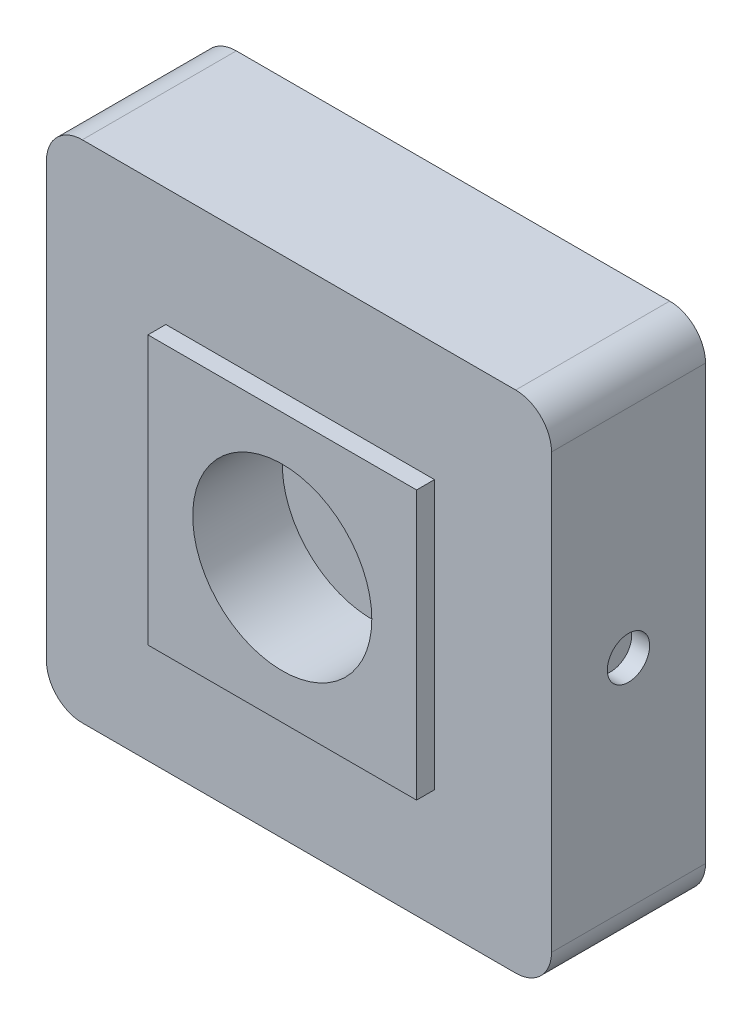
ISO-10303-21;
HEADER;
FILE_DESCRIPTION(('STEP AP214'),'2;1');
FILE_NAME('part.step','',(''),(''),'','','');
FILE_SCHEMA(('AUTOMOTIVE_DESIGN { 1 0 10303 214 1 1 1 1 }'));
ENDSEC;
DATA;
#1=APPLICATION_CONTEXT('core data for automotive mechanical design processes');
#2=APPLICATION_PROTOCOL_DEFINITION('international standard','automotive_design',2000,#1);
#3=PRODUCT_CONTEXT('',#1,'mechanical');
#4=PRODUCT('Part','Part','',(#3));
#5=PRODUCT_RELATED_PRODUCT_CATEGORY('part','',(#4));
#6=PRODUCT_DEFINITION_FORMATION('','',#4);
#7=PRODUCT_DEFINITION_CONTEXT('part definition',#1,'design');
#8=PRODUCT_DEFINITION('design','',#6,#7);
#9=PRODUCT_DEFINITION_SHAPE('','',#8);
#10=(LENGTH_UNIT() NAMED_UNIT(*) SI_UNIT(.MILLI.,.METRE.));
#11=(NAMED_UNIT(*) PLANE_ANGLE_UNIT() SI_UNIT($,.RADIAN.));
#12=(NAMED_UNIT(*) SI_UNIT($,.STERADIAN.) SOLID_ANGLE_UNIT());
#13=UNCERTAINTY_MEASURE_WITH_UNIT(LENGTH_MEASURE(1.E-05),#10,'distance_accuracy_value','');
#14=(GEOMETRIC_REPRESENTATION_CONTEXT(3) GLOBAL_UNCERTAINTY_ASSIGNED_CONTEXT((#13)) GLOBAL_UNIT_ASSIGNED_CONTEXT((#10,
#11,#12)) REPRESENTATION_CONTEXT('',''));
#15=CARTESIAN_POINT('',(0.,0.,0.));
#16=DIRECTION('',(0.,0.,1.));
#17=DIRECTION('',(1.,0.,0.));
#18=AXIS2_PLACEMENT_3D('',#15,#16,#17);
#19=CARTESIAN_POINT('',(2.54,2.54,10.922));
#20=DIRECTION('',(0.,0.,-1.));
#21=DIRECTION('',(-1.,0.,0.));
#22=AXIS2_PLACEMENT_3D('',#19,#20,#21);
#23=PLANE('',#22);
#24=CARTESIAN_POINT('',(2.54,2.54,10.922));
#25=DIRECTION('',(0.,0.,1.));
#26=DIRECTION('',(-1.,0.,0.));
#27=AXIS2_PLACEMENT_3D('',#24,#25,#26);
#28=CIRCLE('',#27,2.54);
#29=CARTESIAN_POINT('',(0.,2.54000000000002,10.922));
#30=VERTEX_POINT('',#29);
#31=CARTESIAN_POINT('',(2.54000000000002,0.,10.922));
#32=VERTEX_POINT('',#31);
#33=EDGE_CURVE('E157',#30,#32,#28,.T.);
#34=ORIENTED_EDGE('',*,*,#33,.T.);
#35=DIRECTION('',(1.,0.,0.));
#36=VECTOR('',#35,1.);
#37=CARTESIAN_POINT('',(2.54000000000002,0.,10.922));
#38=LINE('',#37,#36);
#39=CARTESIAN_POINT('',(33.274,0.,10.922));
#40=VERTEX_POINT('',#39);
#41=EDGE_CURVE('E160',#32,#40,#38,.T.);
#42=ORIENTED_EDGE('',*,*,#41,.T.);
#43=CARTESIAN_POINT('',(33.274,2.54,10.922));
#44=DIRECTION('',(0.,0.,1.));
#45=DIRECTION('',(1.,0.,0.));
#46=AXIS2_PLACEMENT_3D('',#43,#44,#45);
#47=CIRCLE('',#46,2.54);
#48=CARTESIAN_POINT('',(35.814,2.54,10.922));
#49=VERTEX_POINT('',#48);
#50=EDGE_CURVE('E163',#40,#49,#47,.T.);
#51=ORIENTED_EDGE('',*,*,#50,.T.);
#52=DIRECTION('',(0.,1.,0.));
#53=VECTOR('',#52,1.);
#54=CARTESIAN_POINT('',(35.814,2.54000000000002,10.922));
#55=LINE('',#54,#53);
#56=CARTESIAN_POINT('',(35.814,33.274,10.922));
#57=VERTEX_POINT('',#56);
#58=EDGE_CURVE('E165',#49,#57,#55,.T.);
#59=ORIENTED_EDGE('',*,*,#58,.T.);
#60=CARTESIAN_POINT('',(33.274,33.274,10.922));
#61=DIRECTION('',(0.,0.,1.));
#62=DIRECTION('',(-1.,0.,0.));
#63=AXIS2_PLACEMENT_3D('',#60,#61,#62);
#64=CIRCLE('',#63,2.54);
#65=CARTESIAN_POINT('',(33.274,35.814,10.922));
#66=VERTEX_POINT('',#65);
#67=EDGE_CURVE('E167',#57,#66,#64,.T.);
#68=ORIENTED_EDGE('',*,*,#67,.T.);
#69=DIRECTION('',(-1.,0.,0.));
#70=VECTOR('',#69,1.);
#71=CARTESIAN_POINT('',(2.54000000000002,35.814,10.922));
#72=LINE('',#71,#70);
#73=CARTESIAN_POINT('',(2.54000000000002,35.814,10.922));
#74=VERTEX_POINT('',#73);
#75=EDGE_CURVE('E169',#66,#74,#72,.T.);
#76=ORIENTED_EDGE('',*,*,#75,.T.);
#77=CARTESIAN_POINT('',(2.54,33.274,10.922));
#78=DIRECTION('',(0.,0.,1.));
#79=DIRECTION('',(-1.,0.,0.));
#80=AXIS2_PLACEMENT_3D('',#77,#78,#79);
#81=CIRCLE('',#80,2.54);
#82=CARTESIAN_POINT('',(0.,33.274,10.922));
#83=VERTEX_POINT('',#82);
#84=EDGE_CURVE('E171',#74,#83,#81,.T.);
#85=ORIENTED_EDGE('',*,*,#84,.T.);
#86=DIRECTION('',(0.,-1.,0.));
#87=VECTOR('',#86,1.);
#88=CARTESIAN_POINT('',(0.,2.54000000000002,10.922));
#89=LINE('',#88,#87);
#90=EDGE_CURVE('E173',#83,#30,#89,.T.);
#91=ORIENTED_EDGE('',*,*,#90,.T.);
#92=EDGE_LOOP('',(#34,#42,#51,#59,#68,#76,#85,#91));
#93=FACE_BOUND('',#92,.T.);
#94=DIRECTION('',(0.,-1.,0.));
#95=VECTOR('',#94,1.);
#96=CARTESIAN_POINT('',(8.46543456676033,27.432,10.922));
#97=LINE('',#96,#95);
#98=CARTESIAN_POINT('',(8.46543456676033,27.432,10.922));
#99=VERTEX_POINT('',#98);
#100=CARTESIAN_POINT('',(8.46543456676033,8.38199999999999,10.922));
#101=VERTEX_POINT('',#100);
#102=EDGE_CURVE('E54',#99,#101,#97,.T.);
#103=ORIENTED_EDGE('',*,*,#102,.F.);
#104=DIRECTION('',(-1.,0.,0.));
#105=VECTOR('',#104,1.);
#106=CARTESIAN_POINT('',(8.46543456676033,27.432,10.922));
#107=LINE('',#106,#105);
#108=CARTESIAN_POINT('',(27.5154345667603,27.432,10.922));
#109=VERTEX_POINT('',#108);
#110=EDGE_CURVE('E58',#109,#99,#107,.T.);
#111=ORIENTED_EDGE('',*,*,#110,.F.);
#112=DIRECTION('',(0.,1.,0.));
#113=VECTOR('',#112,1.);
#114=CARTESIAN_POINT('',(27.5154345667603,27.432,10.922));
#115=LINE('',#114,#113);
#116=CARTESIAN_POINT('',(27.5154345667603,8.38199999999999,10.922));
#117=VERTEX_POINT('',#116);
#118=EDGE_CURVE('E296',#117,#109,#115,.T.);
#119=ORIENTED_EDGE('',*,*,#118,.F.);
#120=DIRECTION('',(1.,0.,0.));
#121=VECTOR('',#120,1.);
#122=CARTESIAN_POINT('',(8.46543456676033,8.38199999999999,10.922));
#123=LINE('',#122,#121);
#124=EDGE_CURVE('E294',#101,#117,#123,.T.);
#125=ORIENTED_EDGE('',*,*,#124,.F.);
#126=EDGE_LOOP('',(#103,#111,#119,#125));
#127=FACE_BOUND('',#126,.T.);
#128=ADVANCED_FACE('F39',(#93,#127),#23,.F.);
#129=CARTESIAN_POINT('',(2.54,2.54,10.922));
#130=DIRECTION('',(0.,0.,-1.));
#131=DIRECTION('',(-1.,0.,0.));
#132=AXIS2_PLACEMENT_3D('',#129,#130,#131);
#133=CYLINDRICAL_SURFACE('',#132,2.54);
#134=CARTESIAN_POINT('',(2.54,2.54,0.));
#135=DIRECTION('',(0.,0.,1.));
#136=DIRECTION('',(-1.,0.,0.));
#137=AXIS2_PLACEMENT_3D('',#134,#135,#136);
#138=CIRCLE('',#137,2.54);
#139=CARTESIAN_POINT('',(0.,2.54000000000002,0.));
#140=VERTEX_POINT('',#139);
#141=CARTESIAN_POINT('',(2.54000000000002,0.,0.));
#142=VERTEX_POINT('',#141);
#143=EDGE_CURVE('E148',#140,#142,#138,.T.);
#144=ORIENTED_EDGE('',*,*,#143,.T.);
#145=DIRECTION('',(0.,0.,-1.));
#146=VECTOR('',#145,1.);
#147=CARTESIAN_POINT('',(2.54000000000002,0.,10.922));
#148=LINE('',#147,#146);
#149=EDGE_CURVE('E11',#32,#142,#148,.T.);
#150=ORIENTED_EDGE('',*,*,#149,.F.);
#151=ORIENTED_EDGE('',*,*,#33,.F.);
#152=DIRECTION('',(0.,0.,-1.));
#153=VECTOR('',#152,1.);
#154=CARTESIAN_POINT('',(0.,2.54000000000002,10.922));
#155=LINE('',#154,#153);
#156=EDGE_CURVE('E174',#30,#140,#155,.T.);
#157=ORIENTED_EDGE('',*,*,#156,.T.);
#158=EDGE_LOOP('',(#144,#150,#151,#157));
#159=FACE_BOUND('',#158,.T.);
#160=ADVANCED_FACE('F41',(#159),#133,.T.);
#161=CARTESIAN_POINT('',(2.54000000000002,0.,10.922));
#162=DIRECTION('',(0.,1.,0.));
#163=DIRECTION('',(0.,0.,1.));
#164=AXIS2_PLACEMENT_3D('',#161,#162,#163);
#165=PLANE('',#164);
#166=DIRECTION('',(1.,0.,0.));
#167=VECTOR('',#166,1.);
#168=CARTESIAN_POINT('',(2.54000000000002,0.,0.));
#169=LINE('',#168,#167);
#170=CARTESIAN_POINT('',(33.274,0.,0.));
#171=VERTEX_POINT('',#170);
#172=EDGE_CURVE('E151',#142,#171,#169,.T.);
#173=ORIENTED_EDGE('',*,*,#172,.T.);
#174=DIRECTION('',(0.,0.,-1.));
#175=VECTOR('',#174,1.);
#176=CARTESIAN_POINT('',(33.274,0.,10.922));
#177=LINE('',#176,#175);
#178=EDGE_CURVE('E47',#40,#171,#177,.T.);
#179=ORIENTED_EDGE('',*,*,#178,.F.);
#180=ORIENTED_EDGE('',*,*,#41,.F.);
#181=ORIENTED_EDGE('',*,*,#149,.T.);
#182=EDGE_LOOP('',(#173,#179,#180,#181));
#183=FACE_BOUND('',#182,.T.);
#184=ADVANCED_FACE('F231',(#183),#165,.F.);
#185=CARTESIAN_POINT('',(33.274,2.54,10.922));
#186=DIRECTION('',(0.,0.,-1.));
#187=DIRECTION('',(-1.,0.,0.));
#188=AXIS2_PLACEMENT_3D('',#185,#186,#187);
#189=CYLINDRICAL_SURFACE('',#188,2.54);
#190=CARTESIAN_POINT('',(33.274,2.54,0.));
#191=DIRECTION('',(0.,0.,1.));
#192=DIRECTION('',(1.,0.,0.));
#193=AXIS2_PLACEMENT_3D('',#190,#191,#192);
#194=CIRCLE('',#193,2.54);
#195=CARTESIAN_POINT('',(35.814,2.54,0.));
#196=VERTEX_POINT('',#195);
#197=EDGE_CURVE('E177',#171,#196,#194,.T.);
#198=ORIENTED_EDGE('',*,*,#197,.T.);
#199=DIRECTION('',(0.,0.,-1.));
#200=VECTOR('',#199,1.);
#201=CARTESIAN_POINT('',(35.814,2.54,10.922));
#202=LINE('',#201,#200);
#203=EDGE_CURVE('E202',#49,#196,#202,.T.);
#204=ORIENTED_EDGE('',*,*,#203,.F.);
#205=ORIENTED_EDGE('',*,*,#50,.F.);
#206=ORIENTED_EDGE('',*,*,#178,.T.);
#207=EDGE_LOOP('',(#198,#204,#205,#206));
#208=FACE_BOUND('',#207,.T.);
#209=ADVANCED_FACE('F209',(#208),#189,.T.);
#210=CARTESIAN_POINT('',(35.814,2.54000000000002,10.922));
#211=DIRECTION('',(-1.,0.,0.));
#212=DIRECTION('',(0.,0.,1.));
#213=AXIS2_PLACEMENT_3D('',#210,#211,#212);
#214=PLANE('',#213);
#215=CARTESIAN_POINT('',(35.814,17.907,5.461));
#216=DIRECTION('',(1.,0.,0.));
#217=DIRECTION('',(0.,0.,-1.));
#218=AXIS2_PLACEMENT_3D('',#215,#216,#217);
#219=CIRCLE('',#218,1.50000004800011);
#220=CARTESIAN_POINT('',(35.814,17.907,3.96099995199989));
#221=VERTEX_POINT('',#220);
#222=EDGE_CURVE('E281',#221,#221,#219,.T.);
#223=ORIENTED_EDGE('',*,*,#222,.F.);
#224=EDGE_LOOP('',(#223));
#225=FACE_BOUND('',#224,.T.);
#226=DIRECTION('',(0.,1.,0.));
#227=VECTOR('',#226,1.);
#228=CARTESIAN_POINT('',(35.814,2.54000000000002,0.));
#229=LINE('',#228,#227);
#230=CARTESIAN_POINT('',(35.814,33.274,0.));
#231=VERTEX_POINT('',#230);
#232=EDGE_CURVE('E179',#196,#231,#229,.T.);
#233=ORIENTED_EDGE('',*,*,#232,.T.);
#234=DIRECTION('',(0.,0.,-1.));
#235=VECTOR('',#234,1.);
#236=CARTESIAN_POINT('',(35.814,33.274,10.922));
#237=LINE('',#236,#235);
#238=EDGE_CURVE('E199',#57,#231,#237,.T.);
#239=ORIENTED_EDGE('',*,*,#238,.F.);
#240=ORIENTED_EDGE('',*,*,#58,.F.);
#241=ORIENTED_EDGE('',*,*,#203,.T.);
#242=EDGE_LOOP('',(#233,#239,#240,#241));
#243=FACE_BOUND('',#242,.T.);
#244=ADVANCED_FACE('F220',(#225,#243),#214,.F.);
#245=CARTESIAN_POINT('',(33.274,33.274,10.922));
#246=DIRECTION('',(0.,0.,-1.));
#247=DIRECTION('',(-1.,0.,0.));
#248=AXIS2_PLACEMENT_3D('',#245,#246,#247);
#249=CYLINDRICAL_SURFACE('',#248,2.54);
#250=CARTESIAN_POINT('',(33.274,33.274,0.));
#251=DIRECTION('',(0.,0.,1.));
#252=DIRECTION('',(-1.,0.,0.));
#253=AXIS2_PLACEMENT_3D('',#250,#251,#252);
#254=CIRCLE('',#253,2.54);
#255=CARTESIAN_POINT('',(33.274,35.814,0.));
#256=VERTEX_POINT('',#255);
#257=EDGE_CURVE('E181',#231,#256,#254,.T.);
#258=ORIENTED_EDGE('',*,*,#257,.T.);
#259=DIRECTION('',(0.,0.,-1.));
#260=VECTOR('',#259,1.);
#261=CARTESIAN_POINT('',(33.274,35.814,10.922));
#262=LINE('',#261,#260);
#263=EDGE_CURVE('E196',#66,#256,#262,.T.);
#264=ORIENTED_EDGE('',*,*,#263,.F.);
#265=ORIENTED_EDGE('',*,*,#67,.F.);
#266=ORIENTED_EDGE('',*,*,#238,.T.);
#267=EDGE_LOOP('',(#258,#264,#265,#266));
#268=FACE_BOUND('',#267,.T.);
#269=ADVANCED_FACE('F224',(#268),#249,.T.);
#270=CARTESIAN_POINT('',(2.54000000000002,35.814,10.922));
#271=DIRECTION('',(0.,-1.,0.));
#272=DIRECTION('',(0.,0.,-1.));
#273=AXIS2_PLACEMENT_3D('',#270,#271,#272);
#274=PLANE('',#273);
#275=DIRECTION('',(-1.,0.,0.));
#276=VECTOR('',#275,1.);
#277=CARTESIAN_POINT('',(2.54000000000002,35.814,0.));
#278=LINE('',#277,#276);
#279=CARTESIAN_POINT('',(2.54000000000002,35.814,0.));
#280=VERTEX_POINT('',#279);
#281=EDGE_CURVE('E183',#256,#280,#278,.T.);
#282=ORIENTED_EDGE('',*,*,#281,.T.);
#283=DIRECTION('',(0.,0.,-1.));
#284=VECTOR('',#283,1.);
#285=CARTESIAN_POINT('',(2.54000000000002,35.814,10.922));
#286=LINE('',#285,#284);
#287=EDGE_CURVE('E193',#74,#280,#286,.T.);
#288=ORIENTED_EDGE('',*,*,#287,.F.);
#289=ORIENTED_EDGE('',*,*,#75,.F.);
#290=ORIENTED_EDGE('',*,*,#263,.T.);
#291=EDGE_LOOP('',(#282,#288,#289,#290));
#292=FACE_BOUND('',#291,.T.);
#293=ADVANCED_FACE('F244',(#292),#274,.F.);
#294=CARTESIAN_POINT('',(2.54,33.274,10.922));
#295=DIRECTION('',(0.,0.,-1.));
#296=DIRECTION('',(-1.,0.,0.));
#297=AXIS2_PLACEMENT_3D('',#294,#295,#296);
#298=CYLINDRICAL_SURFACE('',#297,2.54);
#299=CARTESIAN_POINT('',(2.54,33.274,0.));
#300=DIRECTION('',(0.,0.,1.));
#301=DIRECTION('',(-1.,0.,0.));
#302=AXIS2_PLACEMENT_3D('',#299,#300,#301);
#303=CIRCLE('',#302,2.54);
#304=CARTESIAN_POINT('',(0.,33.274,0.));
#305=VERTEX_POINT('',#304);
#306=EDGE_CURVE('E185',#280,#305,#303,.T.);
#307=ORIENTED_EDGE('',*,*,#306,.T.);
#308=DIRECTION('',(0.,0.,-1.));
#309=VECTOR('',#308,1.);
#310=CARTESIAN_POINT('',(0.,33.274,10.922));
#311=LINE('',#310,#309);
#312=EDGE_CURVE('E190',#83,#305,#311,.T.);
#313=ORIENTED_EDGE('',*,*,#312,.F.);
#314=ORIENTED_EDGE('',*,*,#84,.F.);
#315=ORIENTED_EDGE('',*,*,#287,.T.);
#316=EDGE_LOOP('',(#307,#313,#314,#315));
#317=FACE_BOUND('',#316,.T.);
#318=ADVANCED_FACE('F242',(#317),#298,.T.);
#319=CARTESIAN_POINT('',(0.,2.54000000000002,10.922));
#320=DIRECTION('',(1.,0.,0.));
#321=DIRECTION('',(0.,0.,-1.));
#322=AXIS2_PLACEMENT_3D('',#319,#320,#321);
#323=PLANE('',#322);
#324=CARTESIAN_POINT('',(0.,17.907,5.461));
#325=DIRECTION('',(-1.,0.,0.));
#326=DIRECTION('',(0.,0.,1.));
#327=AXIS2_PLACEMENT_3D('',#324,#325,#326);
#328=CIRCLE('',#327,1.50000004800011);
#329=CARTESIAN_POINT('',(0.,17.907,6.9610000480001));
#330=VERTEX_POINT('',#329);
#331=EDGE_CURVE('E272',#330,#330,#328,.T.);
#332=ORIENTED_EDGE('',*,*,#331,.F.);
#333=EDGE_LOOP('',(#332));
#334=FACE_BOUND('',#333,.T.);
#335=DIRECTION('',(0.,-1.,0.));
#336=VECTOR('',#335,1.);
#337=CARTESIAN_POINT('',(0.,2.54000000000002,0.));
#338=LINE('',#337,#336);
#339=EDGE_CURVE('E161',#305,#140,#338,.T.);
#340=ORIENTED_EDGE('',*,*,#339,.T.);
#341=ORIENTED_EDGE('',*,*,#156,.F.);
#342=ORIENTED_EDGE('',*,*,#90,.F.);
#343=ORIENTED_EDGE('',*,*,#312,.T.);
#344=EDGE_LOOP('',(#340,#341,#342,#343));
#345=FACE_BOUND('',#344,.T.);
#346=ADVANCED_FACE('F237',(#334,#345),#323,.F.);
#347=CARTESIAN_POINT('',(2.54,2.54,0.));
#348=DIRECTION('',(0.,0.,-1.));
#349=DIRECTION('',(-1.,0.,0.));
#350=AXIS2_PLACEMENT_3D('',#347,#348,#349);
#351=PLANE('',#350);
#352=ORIENTED_EDGE('',*,*,#143,.F.);
#353=ORIENTED_EDGE('',*,*,#339,.F.);
#354=ORIENTED_EDGE('',*,*,#306,.F.);
#355=ORIENTED_EDGE('',*,*,#281,.F.);
#356=ORIENTED_EDGE('',*,*,#257,.F.);
#357=ORIENTED_EDGE('',*,*,#232,.F.);
#358=ORIENTED_EDGE('',*,*,#197,.F.);
#359=ORIENTED_EDGE('',*,*,#172,.F.);
#360=EDGE_LOOP('',(#352,#353,#354,#355,#356,#357,#358,#359));
#361=FACE_BOUND('',#360,.T.);
#362=ADVANCED_FACE('F215',(#361),#351,.T.);
#363=CARTESIAN_POINT('',(8.46543456676033,27.432,12.192));
#364=DIRECTION('',(1.,0.,0.));
#365=DIRECTION('',(0.,0.,-1.));
#366=AXIS2_PLACEMENT_3D('',#363,#364,#365);
#367=PLANE('',#366);
#368=ORIENTED_EDGE('',*,*,#102,.T.);
#369=DIRECTION('',(0.,0.,-1.));
#370=VECTOR('',#369,1.);
#371=CARTESIAN_POINT('',(8.46543456676033,8.38199999999999,12.192));
#372=LINE('',#371,#370);
#373=CARTESIAN_POINT('',(8.46543456676033,8.38199999999999,12.192));
#374=VERTEX_POINT('',#373);
#375=EDGE_CURVE('E131',#374,#101,#372,.T.);
#376=ORIENTED_EDGE('',*,*,#375,.F.);
#377=DIRECTION('',(0.,-1.,0.));
#378=VECTOR('',#377,1.);
#379=CARTESIAN_POINT('',(8.46543456676033,27.432,12.192));
#380=LINE('',#379,#378);
#381=CARTESIAN_POINT('',(8.46543456676033,27.432,12.192));
#382=VERTEX_POINT('',#381);
#383=EDGE_CURVE('E137',#382,#374,#380,.T.);
#384=ORIENTED_EDGE('',*,*,#383,.F.);
#385=DIRECTION('',(0.,0.,-1.));
#386=VECTOR('',#385,1.);
#387=CARTESIAN_POINT('',(8.46543456676033,27.432,12.192));
#388=LINE('',#387,#386);
#389=EDGE_CURVE('E292',#382,#99,#388,.T.);
#390=ORIENTED_EDGE('',*,*,#389,.T.);
#391=EDGE_LOOP('',(#368,#376,#384,#390));
#392=FACE_BOUND('',#391,.T.);
#393=ADVANCED_FACE('F147',(#392),#367,.F.);
#394=CARTESIAN_POINT('',(8.46543456676033,8.38199999999999,12.192));
#395=DIRECTION('',(0.,1.,0.));
#396=DIRECTION('',(0.,0.,1.));
#397=AXIS2_PLACEMENT_3D('',#394,#395,#396);
#398=PLANE('',#397);
#399=ORIENTED_EDGE('',*,*,#124,.T.);
#400=DIRECTION('',(0.,0.,-1.));
#401=VECTOR('',#400,1.);
#402=CARTESIAN_POINT('',(27.5154345667603,8.38199999999999,12.192));
#403=LINE('',#402,#401);
#404=CARTESIAN_POINT('',(27.5154345667603,8.38199999999999,12.192));
#405=VERTEX_POINT('',#404);
#406=EDGE_CURVE('E133',#405,#117,#403,.T.);
#407=ORIENTED_EDGE('',*,*,#406,.F.);
#408=DIRECTION('',(1.,0.,0.));
#409=VECTOR('',#408,1.);
#410=CARTESIAN_POINT('',(8.46543456676033,8.38199999999999,12.192));
#411=LINE('',#410,#409);
#412=EDGE_CURVE('E126',#374,#405,#411,.T.);
#413=ORIENTED_EDGE('',*,*,#412,.F.);
#414=ORIENTED_EDGE('',*,*,#375,.T.);
#415=EDGE_LOOP('',(#399,#407,#413,#414));
#416=FACE_BOUND('',#415,.T.);
#417=ADVANCED_FACE('F129',(#416),#398,.F.);
#418=CARTESIAN_POINT('',(27.5154345667603,27.432,12.192));
#419=DIRECTION('',(-1.,0.,0.));
#420=DIRECTION('',(0.,-1.,0.));
#421=AXIS2_PLACEMENT_3D('',#418,#419,#420);
#422=PLANE('',#421);
#423=ORIENTED_EDGE('',*,*,#118,.T.);
#424=DIRECTION('',(0.,0.,-1.));
#425=VECTOR('',#424,1.);
#426=CARTESIAN_POINT('',(27.5154345667603,27.432,12.192));
#427=LINE('',#426,#425);
#428=CARTESIAN_POINT('',(27.5154345667603,27.432,12.192));
#429=VERTEX_POINT('',#428);
#430=EDGE_CURVE('E153',#429,#109,#427,.T.);
#431=ORIENTED_EDGE('',*,*,#430,.F.);
#432=DIRECTION('',(0.,1.,0.));
#433=VECTOR('',#432,1.);
#434=CARTESIAN_POINT('',(27.5154345667603,27.432,12.192));
#435=LINE('',#434,#433);
#436=EDGE_CURVE('E136',#405,#429,#435,.T.);
#437=ORIENTED_EDGE('',*,*,#436,.F.);
#438=ORIENTED_EDGE('',*,*,#406,.T.);
#439=EDGE_LOOP('',(#423,#431,#437,#438));
#440=FACE_BOUND('',#439,.T.);
#441=ADVANCED_FACE('F304',(#440),#422,.F.);
#442=CARTESIAN_POINT('',(8.46543456676033,27.432,12.192));
#443=DIRECTION('',(0.,-1.,0.));
#444=DIRECTION('',(0.,0.,-1.));
#445=AXIS2_PLACEMENT_3D('',#442,#443,#444);
#446=PLANE('',#445);
#447=ORIENTED_EDGE('',*,*,#110,.T.);
#448=ORIENTED_EDGE('',*,*,#389,.F.);
#449=DIRECTION('',(-1.,0.,0.));
#450=VECTOR('',#449,1.);
#451=CARTESIAN_POINT('',(8.46543456676033,27.432,12.192));
#452=LINE('',#451,#450);
#453=EDGE_CURVE('E142',#429,#382,#452,.T.);
#454=ORIENTED_EDGE('',*,*,#453,.F.);
#455=ORIENTED_EDGE('',*,*,#430,.T.);
#456=EDGE_LOOP('',(#447,#448,#454,#455));
#457=FACE_BOUND('',#456,.T.);
#458=ADVANCED_FACE('F302',(#457),#446,.F.);
#459=CARTESIAN_POINT('',(0.,0.,12.192));
#460=DIRECTION('',(0.,0.,1.));
#461=DIRECTION('',(1.,0.,0.));
#462=AXIS2_PLACEMENT_3D('',#459,#460,#461);
#463=PLANE('',#462);
#464=CARTESIAN_POINT('',(17.9904345667603,17.907,12.192));
#465=DIRECTION('',(0.,0.,1.));
#466=DIRECTION('',(1.,0.,0.));
#467=AXIS2_PLACEMENT_3D('',#464,#465,#466);
#468=CIRCLE('',#467,6.35);
#469=CARTESIAN_POINT('',(24.3404345667603,17.907,12.192));
#470=VERTEX_POINT('',#469);
#471=EDGE_CURVE('E278',#470,#470,#468,.T.);
#472=ORIENTED_EDGE('',*,*,#471,.F.);
#473=EDGE_LOOP('',(#472));
#474=FACE_BOUND('',#473,.T.);
#475=ORIENTED_EDGE('',*,*,#383,.T.);
#476=ORIENTED_EDGE('',*,*,#412,.T.);
#477=ORIENTED_EDGE('',*,*,#436,.T.);
#478=ORIENTED_EDGE('',*,*,#453,.T.);
#479=EDGE_LOOP('',(#475,#476,#477,#478));
#480=FACE_BOUND('',#479,.T.);
#481=ADVANCED_FACE('F140',(#474,#480),#463,.T.);
#482=CARTESIAN_POINT('',(17.9904345667603,17.907,5.842));
#483=DIRECTION('',(0.,0.,1.));
#484=DIRECTION('',(1.,0.,0.));
#485=AXIS2_PLACEMENT_3D('',#482,#483,#484);
#486=CYLINDRICAL_SURFACE('',#485,6.35);
#487=CARTESIAN_POINT('',(17.9904345667603,17.907,5.842));
#488=DIRECTION('',(0.,0.,1.));
#489=DIRECTION('',(1.,0.,0.));
#490=AXIS2_PLACEMENT_3D('',#487,#488,#489);
#491=CIRCLE('',#490,6.35);
#492=CARTESIAN_POINT('',(24.3404345667603,17.907,5.842));
#493=VERTEX_POINT('',#492);
#494=EDGE_CURVE('E285',#493,#493,#491,.T.);
#495=ORIENTED_EDGE('',*,*,#494,.F.);
#496=EDGE_LOOP('',(#495));
#497=FACE_BOUND('',#496,.T.);
#498=ORIENTED_EDGE('',*,*,#471,.T.);
#499=EDGE_LOOP('',(#498));
#500=FACE_BOUND('',#499,.T.);
#501=ADVANCED_FACE('F315',(#497,#500),#486,.F.);
#502=CARTESIAN_POINT('',(17.9904345667603,17.907,5.842));
#503=DIRECTION('',(0.,0.,1.));
#504=DIRECTION('',(1.,0.,0.));
#505=AXIS2_PLACEMENT_3D('',#502,#503,#504);
#506=PLANE('',#505);
#507=ORIENTED_EDGE('',*,*,#494,.T.);
#508=EDGE_LOOP('',(#507));
#509=FACE_BOUND('',#508,.T.);
#510=ADVANCED_FACE('F319',(#509),#506,.T.);
#511=CARTESIAN_POINT('',(1.27,17.907,5.461));
#512=DIRECTION('',(-1.,0.,0.));
#513=DIRECTION('',(0.,0.,1.));
#514=AXIS2_PLACEMENT_3D('',#511,#512,#513);
#515=CYLINDRICAL_SURFACE('',#514,1.50000004800011);
#516=CARTESIAN_POINT('',(1.27,17.907,5.461));
#517=DIRECTION('',(-1.,0.,0.));
#518=DIRECTION('',(0.,0.,1.));
#519=AXIS2_PLACEMENT_3D('',#516,#517,#518);
#520=CIRCLE('',#519,1.50000004800011);
#521=CARTESIAN_POINT('',(1.27,17.907,6.9610000480001));
#522=VERTEX_POINT('',#521);
#523=EDGE_CURVE('E274',#522,#522,#520,.T.);
#524=ORIENTED_EDGE('',*,*,#523,.F.);
#525=EDGE_LOOP('',(#524));
#526=FACE_BOUND('',#525,.T.);
#527=ORIENTED_EDGE('',*,*,#331,.T.);
#528=EDGE_LOOP('',(#527));
#529=FACE_BOUND('',#528,.T.);
#530=ADVANCED_FACE('F322',(#526,#529),#515,.F.);
#531=CARTESIAN_POINT('',(1.27,17.907,5.461));
#532=DIRECTION('',(-1.,0.,0.));
#533=DIRECTION('',(0.,0.,1.));
#534=AXIS2_PLACEMENT_3D('',#531,#532,#533);
#535=PLANE('',#534);
#536=ORIENTED_EDGE('',*,*,#523,.T.);
#537=EDGE_LOOP('',(#536));
#538=FACE_BOUND('',#537,.T.);
#539=ADVANCED_FACE('F325',(#538),#535,.T.);
#540=CARTESIAN_POINT('',(34.544,17.907,5.461));
#541=DIRECTION('',(1.,0.,0.));
#542=DIRECTION('',(0.,0.,-1.));
#543=AXIS2_PLACEMENT_3D('',#540,#541,#542);
#544=CYLINDRICAL_SURFACE('',#543,1.50000004800011);
#545=CARTESIAN_POINT('',(34.544,17.907,5.461));
#546=DIRECTION('',(1.,0.,0.));
#547=DIRECTION('',(0.,0.,-1.));
#548=AXIS2_PLACEMENT_3D('',#545,#546,#547);
#549=CIRCLE('',#548,1.50000004800011);
#550=CARTESIAN_POINT('',(34.544,17.907,3.96099995199989));
#551=VERTEX_POINT('',#550);
#552=EDGE_CURVE('E275',#551,#551,#549,.T.);
#553=ORIENTED_EDGE('',*,*,#552,.F.);
#554=EDGE_LOOP('',(#553));
#555=FACE_BOUND('',#554,.T.);
#556=ORIENTED_EDGE('',*,*,#222,.T.);
#557=EDGE_LOOP('',(#556));
#558=FACE_BOUND('',#557,.T.);
#559=ADVANCED_FACE('F329',(#555,#558),#544,.F.);
#560=CARTESIAN_POINT('',(34.544,17.907,5.461));
#561=DIRECTION('',(1.,0.,0.));
#562=DIRECTION('',(0.,0.,-1.));
#563=AXIS2_PLACEMENT_3D('',#560,#561,#562);
#564=PLANE('',#563);
#565=ORIENTED_EDGE('',*,*,#552,.T.);
#566=EDGE_LOOP('',(#565));
#567=FACE_BOUND('',#566,.T.);
#568=ADVANCED_FACE('F333',(#567),#564,.T.);
#569=CLOSED_SHELL('',(#128,#160,#184,#209,#244,#269,#293,#318,#346,#362,#393,#417,#441,#458,
#481,#501,#510,#530,#539,#559,#568));
#570=MANIFOLD_SOLID_BREP('B2',#569);
#571=ADVANCED_BREP_SHAPE_REPRESENTATION('',(#18,#570),#14);
#572=SHAPE_DEFINITION_REPRESENTATION(#9,#571);
ENDSEC;
END-ISO-10303-21;
